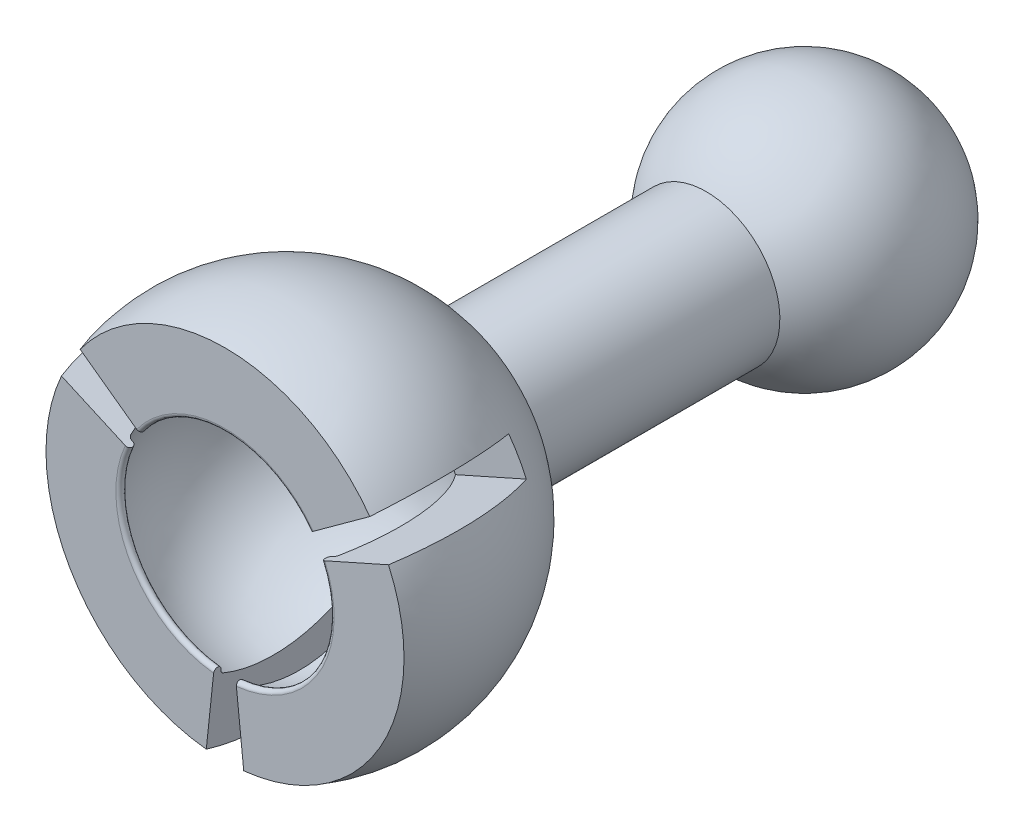
ISO-10303-21;
HEADER;
FILE_DESCRIPTION(('STEP AP214'),'2;1');
FILE_NAME('part.step','',(''),(''),'','','');
FILE_SCHEMA(('AUTOMOTIVE_DESIGN { 1 0 10303 214 1 1 1 1 }'));
ENDSEC;
DATA;
#1=APPLICATION_CONTEXT('core data for automotive mechanical design processes');
#2=APPLICATION_PROTOCOL_DEFINITION('international standard','automotive_design',2000,#1);
#3=PRODUCT_CONTEXT('',#1,'mechanical');
#4=PRODUCT('Part','Part','',(#3));
#5=PRODUCT_RELATED_PRODUCT_CATEGORY('part','',(#4));
#6=PRODUCT_DEFINITION_FORMATION('','',#4);
#7=PRODUCT_DEFINITION_CONTEXT('part definition',#1,'design');
#8=PRODUCT_DEFINITION('design','',#6,#7);
#9=PRODUCT_DEFINITION_SHAPE('','',#8);
#10=(LENGTH_UNIT() NAMED_UNIT(*) SI_UNIT(.MILLI.,.METRE.));
#11=(NAMED_UNIT(*) PLANE_ANGLE_UNIT() SI_UNIT($,.RADIAN.));
#12=(NAMED_UNIT(*) SI_UNIT($,.STERADIAN.) SOLID_ANGLE_UNIT());
#13=UNCERTAINTY_MEASURE_WITH_UNIT(LENGTH_MEASURE(1.E-05),#10,'distance_accuracy_value','');
#14=(GEOMETRIC_REPRESENTATION_CONTEXT(3) GLOBAL_UNCERTAINTY_ASSIGNED_CONTEXT((#13)) GLOBAL_UNIT_ASSIGNED_CONTEXT((#10,
#11,#12)) REPRESENTATION_CONTEXT('',''));
#15=CARTESIAN_POINT('',(0.,0.,0.));
#16=DIRECTION('',(0.,0.,1.));
#17=DIRECTION('',(1.,0.,0.));
#18=AXIS2_PLACEMENT_3D('',#15,#16,#17);
#19=CARTESIAN_POINT('',(0.,-7.29109045342327,19.6));
#20=DIRECTION('',(0.,0.,1.));
#21=DIRECTION('',(0.,-1.,0.));
#22=AXIS2_PLACEMENT_3D('',#19,#20,#21);
#23=PLANE('',#22);
#24=CARTESIAN_POINT('',(0.,0.,19.6));
#25=DIRECTION('',(0.,0.,1.));
#26=DIRECTION('',(0.,-1.,0.));
#27=AXIS2_PLACEMENT_3D('',#24,#25,#26);
#28=CIRCLE('',#27,7.29109045342327);
#29=CARTESIAN_POINT('',(5.89861608434435,4.28559544165267,19.6));
#30=VERTEX_POINT('',#29);
#31=CARTESIAN_POINT('',(-5.89861608434441,4.28559544165258,19.6));
#32=VERTEX_POINT('',#31);
#33=EDGE_CURVE('E289',#30,#32,#28,.T.);
#34=ORIENTED_EDGE('',*,*,#33,.T.);
#35=DIRECTION('',(-0.809016994374953,0.587785252292466,0.));
#36=VECTOR('',#35,1.);
#37=CARTESIAN_POINT('',(-5.89861608434441,4.28559544165258,19.6));
#38=LINE('',#37,#36);
#39=CARTESIAN_POINT('',(-3.5962602665025,2.61283602538991,19.6));
#40=VERTEX_POINT('',#39);
#41=EDGE_CURVE('E174',#40,#32,#38,.T.);
#42=ORIENTED_EDGE('',*,*,#41,.F.);
#43=CARTESIAN_POINT('',(0.,0.,19.6));
#44=DIRECTION('',(0.,0.,1.));
#45=DIRECTION('',(0.,-1.,0.));
#46=AXIS2_PLACEMENT_3D('',#43,#44,#45);
#47=CIRCLE('',#46,4.44522215417857);
#48=CARTESIAN_POINT('',(3.59626026650247,2.61283602538996,19.6));
#49=VERTEX_POINT('',#48);
#50=EDGE_CURVE('E285',#49,#40,#47,.T.);
#51=ORIENTED_EDGE('',*,*,#50,.F.);
#52=DIRECTION('',(0.809016994374945,0.587785252292477,0.));
#53=VECTOR('',#52,1.);
#54=CARTESIAN_POINT('',(5.89861608434435,4.28559544165267,19.6));
#55=LINE('',#54,#53);
#56=EDGE_CURVE('E223',#49,#30,#55,.T.);
#57=ORIENTED_EDGE('',*,*,#56,.T.);
#58=EDGE_LOOP('',(#34,#42,#51,#57));
#59=FACE_BOUND('',#58,.T.);
#60=ADVANCED_FACE('F43',(#59),#23,.T.);
#61=CARTESIAN_POINT('',(0.,0.,19.45));
#62=DIRECTION('',(0.,0.,1.));
#63=DIRECTION('',(0.,-1.,0.));
#64=AXIS2_PLACEMENT_3D('',#61,#62,#63);
#65=TOROIDAL_SURFACE('',#64,4.44522215417857,0.15);
#66=ORIENTED_EDGE('',*,*,#50,.T.);
#67=CARTESIAN_POINT('',(-3.5962602665025,2.61283602538991,19.45));
#68=DIRECTION('',(-0.587785252292466,-0.809016994374953,0.));
#69=DIRECTION('',(0.,0.,-1.));
#70=AXIS2_PLACEMENT_3D('',#67,#68,#69);
#71=CIRCLE('',#70,0.15);
#72=CARTESIAN_POINT('',(-3.6058111047905,2.61977511558424,19.3004652865878));
#73=VERTEX_POINT('',#72);
#74=EDGE_CURVE('E383',#73,#40,#71,.T.);
#75=ORIENTED_EDGE('',*,*,#74,.F.);
#76=CARTESIAN_POINT('',(0.,0.,19.3004652865878));
#77=DIRECTION('',(0.,0.,1.));
#78=DIRECTION('',(0.,-1.,0.));
#79=AXIS2_PLACEMENT_3D('',#76,#77,#78);
#80=CIRCLE('',#79,4.45702763954465);
#81=CARTESIAN_POINT('',(3.60581110479047,2.61977511558429,19.3004652865878));
#82=VERTEX_POINT('',#81);
#83=EDGE_CURVE('E280',#82,#73,#80,.T.);
#84=ORIENTED_EDGE('',*,*,#83,.F.);
#85=CARTESIAN_POINT('',(3.59626026650247,2.61283602538996,19.45));
#86=DIRECTION('',(-0.587785252292477,0.809016994374945,0.));
#87=DIRECTION('',(0.,0.,-1.));
#88=AXIS2_PLACEMENT_3D('',#85,#86,#87);
#89=CIRCLE('',#88,0.15);
#90=EDGE_CURVE('E220',#82,#49,#89,.T.);
#91=ORIENTED_EDGE('',*,*,#90,.T.);
#92=EDGE_LOOP('',(#66,#75,#84,#91));
#93=FACE_BOUND('',#92,.T.);
#94=ADVANCED_FACE('F307',(#93),#65,.T.);
#95=CARTESIAN_POINT('',(0.,0.,19.1010856687048));
#96=DIRECTION('',(0.,0.,1.));
#97=DIRECTION('',(0.,-1.,0.));
#98=AXIS2_PLACEMENT_3D('',#95,#96,#97);
#99=TOROIDAL_SURFACE('',#98,4.47276828669942,0.199999999999998);
#100=ORIENTED_EDGE('',*,*,#83,.T.);
#101=CARTESIAN_POINT('',(-3.61854555584117,2.62902723584336,19.1010856687048));
#102=DIRECTION('',(0.587785252292466,0.809016994374953,0.));
#103=DIRECTION('',(0.,0.,-1.));
#104=AXIS2_PLACEMENT_3D('',#101,#102,#103);
#105=CIRCLE('',#104,0.199999999999998);
#106=CARTESIAN_POINT('',(-3.76624129281428,2.73633446995941,19.1827626347744));
#107=VERTEX_POINT('',#106);
#108=EDGE_CURVE('E381',#107,#73,#105,.T.);
#109=ORIENTED_EDGE('',*,*,#108,.F.);
#110=CARTESIAN_POINT('',(0.,0.,19.1827626347744));
#111=DIRECTION('',(0.,0.,1.));
#112=DIRECTION('',(0.,-1.,0.));
#113=AXIS2_PLACEMENT_3D('',#110,#111,#112);
#114=CIRCLE('',#113,4.65533025758511);
#115=CARTESIAN_POINT('',(3.76624129281424,2.73633446995946,19.1827626347744));
#116=VERTEX_POINT('',#115);
#117=EDGE_CURVE('E275',#116,#107,#114,.T.);
#118=ORIENTED_EDGE('',*,*,#117,.F.);
#119=CARTESIAN_POINT('',(3.61854555584113,2.62902723584341,19.1010856687048));
#120=DIRECTION('',(0.587785252292477,-0.809016994374945,0.));
#121=DIRECTION('',(0.,0.,-1.));
#122=AXIS2_PLACEMENT_3D('',#119,#120,#121);
#123=CIRCLE('',#122,0.199999999999998);
#124=EDGE_CURVE('E217',#116,#82,#123,.T.);
#125=ORIENTED_EDGE('',*,*,#124,.T.);
#126=EDGE_LOOP('',(#100,#109,#118,#125));
#127=FACE_BOUND('',#126,.T.);
#128=ADVANCED_FACE('F315',(#127),#99,.F.);
#129=CARTESIAN_POINT('',(0.762126480641795,-7.25114909704004,19.6));
#130=VERTEX_POINT('',#129);
#131=CARTESIAN_POINT('',(6.66074256498615,2.96555365538742,19.6));
#132=VERTEX_POINT('',#131);
#133=EDGE_CURVE('E286',#130,#132,#28,.T.);
#134=ORIENTED_EDGE('',*,*,#133,.T.);
#135=DIRECTION('',(0.913545457642599,0.406736643075804,0.));
#136=VECTOR('',#135,1.);
#137=CARTESIAN_POINT('',(6.66074256498615,2.96555365538742,19.6));
#138=LINE('',#137,#136);
#139=CARTESIAN_POINT('',(4.06091250716208,1.80803473671678,19.6));
#140=VERTEX_POINT('',#139);
#141=EDGE_CURVE('E207',#140,#132,#138,.T.);
#142=ORIENTED_EDGE('',*,*,#141,.F.);
#143=CARTESIAN_POINT('',(0.464652240659615,-4.42087076210671,19.6));
#144=VERTEX_POINT('',#143);
#145=EDGE_CURVE('E281',#144,#140,#47,.T.);
#146=ORIENTED_EDGE('',*,*,#145,.F.);
#147=DIRECTION('',(0.104528463267654,-0.994521895368273,0.));
#148=VECTOR('',#147,1.);
#149=CARTESIAN_POINT('',(0.762126480641795,-7.25114909704004,19.6));
#150=LINE('',#149,#148);
#151=EDGE_CURVE('E262',#144,#130,#150,.T.);
#152=ORIENTED_EDGE('',*,*,#151,.T.);
#153=EDGE_LOOP('',(#134,#142,#146,#152));
#154=FACE_BOUND('',#153,.T.);
#155=ADVANCED_FACE('F310',(#154),#23,.T.);
#156=ORIENTED_EDGE('',*,*,#145,.T.);
#157=CARTESIAN_POINT('',(4.06091250716208,1.80803473671679,19.45));
#158=DIRECTION('',(-0.406736643075804,0.913545457642599,0.));
#159=DIRECTION('',(0.,0.,-1.));
#160=AXIS2_PLACEMENT_3D('',#157,#158,#159);
#161=CIRCLE('',#160,0.15);
#162=CARTESIAN_POINT('',(4.07169735469353,1.81283646020446,19.3004652865878));
#163=VERTEX_POINT('',#162);
#164=EDGE_CURVE('E205',#163,#140,#161,.T.);
#165=ORIENTED_EDGE('',*,*,#164,.F.);
#166=CARTESIAN_POINT('',(0.46588624990306,-4.43261157578873,19.3004652865878));
#167=VERTEX_POINT('',#166);
#168=EDGE_CURVE('E276',#167,#163,#80,.T.);
#169=ORIENTED_EDGE('',*,*,#168,.F.);
#170=CARTESIAN_POINT('',(0.464652240659615,-4.42087076210671,19.45));
#171=DIRECTION('',(0.994521895368273,0.104528463267654,0.));
#172=DIRECTION('',(0.,0.,-1.));
#173=AXIS2_PLACEMENT_3D('',#170,#171,#172);
#174=CIRCLE('',#173,0.15);
#175=EDGE_CURVE('E259',#167,#144,#174,.T.);
#176=ORIENTED_EDGE('',*,*,#175,.T.);
#177=EDGE_LOOP('',(#156,#165,#169,#176));
#178=FACE_BOUND('',#177,.T.);
#179=ADVANCED_FACE('F318',(#178),#65,.T.);
#180=ORIENTED_EDGE('',*,*,#168,.T.);
#181=CARTESIAN_POINT('',(4.08607715140213,1.81923875818804,19.1010856687048));
#182=DIRECTION('',(0.406736643075804,-0.913545457642599,0.));
#183=DIRECTION('',(0.,0.,-1.));
#184=AXIS2_PLACEMENT_3D('',#181,#182,#183);
#185=CIRCLE('',#184,0.199999999999998);
#186=CARTESIAN_POINT('',(4.25285581064303,1.89349340137938,19.1827626347744));
#187=VERTEX_POINT('',#186);
#188=EDGE_CURVE('E203',#187,#163,#185,.T.);
#189=ORIENTED_EDGE('',*,*,#188,.F.);
#190=CARTESIAN_POINT('',(0.486614517828782,-4.62982787133882,19.1827626347744));
#191=VERTEX_POINT('',#190);
#192=EDGE_CURVE('E271',#191,#187,#114,.T.);
#193=ORIENTED_EDGE('',*,*,#192,.F.);
#194=CARTESIAN_POINT('',(0.467531595560987,-4.44826599403141,19.1010856687048));
#195=DIRECTION('',(-0.994521895368273,-0.104528463267654,0.));
#196=DIRECTION('',(0.,0.,-1.));
#197=AXIS2_PLACEMENT_3D('',#194,#195,#196);
#198=CIRCLE('',#197,0.199999999999998);
#199=EDGE_CURVE('E256',#191,#167,#198,.T.);
#200=ORIENTED_EDGE('',*,*,#199,.T.);
#201=EDGE_LOOP('',(#180,#189,#193,#200));
#202=FACE_BOUND('',#201,.T.);
#203=ADVANCED_FACE('F354',(#202),#99,.F.);
#204=CARTESIAN_POINT('',(0.,0.,17.1));
#205=DIRECTION('',(0.,0.,1.));
#206=DIRECTION('',(0.,-1.,0.));
#207=AXIS2_PLACEMENT_3D('',#204,#205,#206);
#208=SPHERICAL_SURFACE('',#207,5.1);
#209=CARTESIAN_POINT('',(0.,0.,12.0554484837599));
#210=DIRECTION('',(0.,0.,1.));
#211=DIRECTION('',(1.,0.,0.));
#212=AXIS2_PLACEMENT_3D('',#209,#210,#211);
#213=CIRCLE('',#212,0.75);
#214=CARTESIAN_POINT('',(0.75,0.,12.0554484837599));
#215=VERTEX_POINT('',#214);
#216=EDGE_CURVE('E179',#215,#215,#213,.T.);
#217=ORIENTED_EDGE('',*,*,#216,.F.);
#218=EDGE_LOOP('',(#217));
#219=FACE_BOUND('',#218,.T.);
#220=CARTESIAN_POINT('',(0.,0.,17.1));
#221=DIRECTION('',(0.406736643075791,0.913545457642605,0.));
#222=DIRECTION('',(0.,0.,-1.));
#223=AXIS2_PLACEMENT_3D('',#220,#221,#222);
#224=CIRCLE('',#223,5.1);
#225=CARTESIAN_POINT('',(-3.38874882098821,1.50876818240939,13.6));
#226=VERTEX_POINT('',#225);
#227=CARTESIAN_POINT('',(-4.25285581064305,1.89349340137932,19.1827626347744));
#228=VERTEX_POINT('',#227);
#229=EDGE_CURVE('E373',#226,#228,#224,.T.);
#230=ORIENTED_EDGE('',*,*,#229,.T.);
#231=CARTESIAN_POINT('',(-0.486614517828782,-4.62982787133882,19.1827626347744));
#232=VERTEX_POINT('',#231);
#233=EDGE_CURVE('E270',#228,#232,#114,.T.);
#234=ORIENTED_EDGE('',*,*,#233,.T.);
#235=CARTESIAN_POINT('',(0.,0.,17.1));
#236=DIRECTION('',(-0.994521895368273,0.104528463267654,0.));
#237=DIRECTION('',(0.,0.,-1.));
#238=AXIS2_PLACEMENT_3D('',#235,#236,#237);
#239=CIRCLE('',#238,5.1);
#240=CARTESIAN_POINT('',(-0.387742836105862,-3.68912665722506,13.6));
#241=VERTEX_POINT('',#240);
#242=EDGE_CURVE('E236',#241,#232,#239,.T.);
#243=ORIENTED_EDGE('',*,*,#242,.F.);
#244=CARTESIAN_POINT('',(0.,0.,13.6));
#245=DIRECTION('',(0.,0.,-1.));
#246=DIRECTION('',(-1.,0.,0.));
#247=AXIS2_PLACEMENT_3D('',#244,#245,#246);
#248=CIRCLE('',#247,3.70944739819827);
#249=CARTESIAN_POINT('',(0.387742836105862,-3.68912665722506,13.6));
#250=VERTEX_POINT('',#249);
#251=EDGE_CURVE('E265',#250,#241,#248,.T.);
#252=ORIENTED_EDGE('',*,*,#251,.F.);
#253=CARTESIAN_POINT('',(0.,0.,17.1));
#254=DIRECTION('',(-0.994521895368273,-0.104528463267654,0.));
#255=DIRECTION('',(0.,0.,-1.));
#256=AXIS2_PLACEMENT_3D('',#253,#254,#255);
#257=CIRCLE('',#256,5.1);
#258=EDGE_CURVE('E253',#250,#191,#257,.T.);
#259=ORIENTED_EDGE('',*,*,#258,.T.);
#260=ORIENTED_EDGE('',*,*,#192,.T.);
#261=CARTESIAN_POINT('',(0.,0.,17.1));
#262=DIRECTION('',(0.406736643075804,-0.913545457642599,0.));
#263=DIRECTION('',(0.,0.,-1.));
#264=AXIS2_PLACEMENT_3D('',#261,#262,#263);
#265=CIRCLE('',#264,5.1);
#266=CARTESIAN_POINT('',(3.38874882098819,1.50876818240944,13.6));
#267=VERTEX_POINT('',#266);
#268=EDGE_CURVE('E67',#267,#187,#265,.T.);
#269=ORIENTED_EDGE('',*,*,#268,.F.);
#270=CARTESIAN_POINT('',(0.,0.,13.6));
#271=DIRECTION('',(0.,0.,-1.));
#272=DIRECTION('',(0.500000000000004,-0.866025403784436,0.));
#273=AXIS2_PLACEMENT_3D('',#270,#271,#272);
#274=CIRCLE('',#273,3.70944739819827);
#275=CARTESIAN_POINT('',(3.00100598488232,2.18035847481564,13.6));
#276=VERTEX_POINT('',#275);
#277=EDGE_CURVE('E226',#276,#267,#274,.T.);
#278=ORIENTED_EDGE('',*,*,#277,.F.);
#279=CARTESIAN_POINT('',(0.,0.,17.1));
#280=DIRECTION('',(0.587785252292477,-0.809016994374945,0.));
#281=DIRECTION('',(0.,0.,-1.));
#282=AXIS2_PLACEMENT_3D('',#279,#280,#281);
#283=CIRCLE('',#282,5.1);
#284=EDGE_CURVE('E214',#276,#116,#283,.T.);
#285=ORIENTED_EDGE('',*,*,#284,.T.);
#286=ORIENTED_EDGE('',*,*,#117,.T.);
#287=CARTESIAN_POINT('',(0.,0.,17.1));
#288=DIRECTION('',(0.587785252292466,0.809016994374953,0.));
#289=DIRECTION('',(0.,0.,-1.));
#290=AXIS2_PLACEMENT_3D('',#287,#288,#289);
#291=CIRCLE('',#290,5.1);
#292=CARTESIAN_POINT('',(-3.00100598488235,2.1803584748156,13.6));
#293=VERTEX_POINT('',#292);
#294=EDGE_CURVE('E59',#293,#107,#291,.T.);
#295=ORIENTED_EDGE('',*,*,#294,.F.);
#296=CARTESIAN_POINT('',(0.,0.,13.6));
#297=DIRECTION('',(0.,0.,-1.));
#298=DIRECTION('',(0.499999999999992,0.866025403784443,0.));
#299=AXIS2_PLACEMENT_3D('',#296,#297,#298);
#300=CIRCLE('',#299,3.70944739819827);
#301=EDGE_CURVE('E186',#226,#293,#300,.T.);
#302=ORIENTED_EDGE('',*,*,#301,.F.);
#303=EDGE_LOOP('',(#230,#234,#243,#252,#259,#260,#269,#278,#285,#286,#295,#302));
#304=FACE_BOUND('',#303,.T.);
#305=ADVANCED_FACE('F45',(#219,#304),#208,.F.);
#306=CARTESIAN_POINT('',(0.,0.,-4.));
#307=DIRECTION('',(0.,0.,1.));
#308=DIRECTION('',(0.,-1.,0.));
#309=AXIS2_PLACEMENT_3D('',#306,#307,#308);
#310=SPHERICAL_SURFACE('',#309,5.);
#311=CARTESIAN_POINT('',(0.,0.,-8.9434299833213));
#312=DIRECTION('',(0.,0.,1.));
#313=DIRECTION('',(1.,0.,0.));
#314=AXIS2_PLACEMENT_3D('',#311,#312,#313);
#315=CIRCLE('',#314,0.75);
#316=CARTESIAN_POINT('',(0.,-0.749999999999988,-8.9434299833213));
#317=VERTEX_POINT('',#316);
#318=EDGE_CURVE('E47',#317,#317,#315,.F.);
#319=CARTESIAN_POINT('',(0.,0.,0.));
#320=DIRECTION('',(0.,0.,1.));
#321=DIRECTION('',(0.,-1.,0.));
#322=AXIS2_PLACEMENT_3D('',#319,#320,#321);
#323=CIRCLE('',#322,3.);
#324=CARTESIAN_POINT('',(0.,-3.,0.));
#325=VERTEX_POINT('',#324);
#326=EDGE_CURVE('E11',#325,#325,#323,.T.);
#327=CARTESIAN_POINT('',(0.,-0.749999999999988,-8.9434299833213));
#328=CARTESIAN_POINT('',(0.,-0.870885414938892,-8.92509841181209));
#329=CARTESIAN_POINT('',(0.,-0.991094481339852,-8.90231620034963));
#330=CARTESIAN_POINT('',(0.,-1.22952172383884,-8.84801013620433));
#331=CARTESIAN_POINT('',(0.,-1.34773989993687,-8.81648628352149));
#332=CARTESIAN_POINT('',(0.,-1.58154716860296,-8.74485657562153));
#333=CARTESIAN_POINT('',(0.,-1.69713626117102,-8.70475072040442));
#334=CARTESIAN_POINT('',(0.,-1.92506418177985,-8.61617541121397));
#335=CARTESIAN_POINT('',(0.,-2.03740300982062,-8.56770595724064));
#336=CARTESIAN_POINT('',(0.,-2.25822593558462,-8.46266346839177));
#337=CARTESIAN_POINT('',(0.,-2.36671003330785,-8.40609043351624));
#338=CARTESIAN_POINT('',(0.,-2.57923997439409,-8.28514529687983));
#339=CARTESIAN_POINT('',(0.,-2.68328581775711,-8.22077319511896));
#340=CARTESIAN_POINT('',(0.,-2.88637954553864,-8.08457614978542));
#341=CARTESIAN_POINT('',(0.,-2.98542742995715,-8.01275120621274));
#342=CARTESIAN_POINT('',(0.,-3.17799243553554,-7.86203485828768));
#343=CARTESIAN_POINT('',(0.,-3.27150955669543,-7.7831434539353));
#344=CARTESIAN_POINT('',(0.,-3.45250997906654,-7.61871856063181));
#345=CARTESIAN_POINT('',(0.,-3.53999328027776,-7.53318507168069));
#346=CARTESIAN_POINT('',(0.,-3.70845546479972,-7.35593611973297));
#347=CARTESIAN_POINT('',(0.,-3.78943434811046,-7.26422065673636));
#348=CARTESIAN_POINT('',(0.,-3.94445208775483,-7.07510112064164));
#349=CARTESIAN_POINT('',(0.,-4.01849094408845,-6.97769704754354));
#350=CARTESIAN_POINT('',(0.,-4.15923035320616,-6.77772425621644));
#351=CARTESIAN_POINT('',(0.,-4.22593090599023,-6.67515553798745));
#352=CARTESIAN_POINT('',(0.,-4.35163490628967,-6.465405203411));
#353=CARTESIAN_POINT('',(0.,-4.41063835380503,-6.35822358706355));
#354=CARTESIAN_POINT('',(0.,-4.5206307468261,-6.13982401741015));
#355=CARTESIAN_POINT('',(0.,-4.5716196923318,-6.0286060641042));
#356=CARTESIAN_POINT('',(0.,-4.66530879693345,-5.80273209432034));
#357=CARTESIAN_POINT('',(0.,-4.7080089560294,-5.68807607784242));
#358=CARTESIAN_POINT('',(0.,-4.78489079120991,-5.45594274984674));
#359=CARTESIAN_POINT('',(0.,-4.81907246729446,-5.33846543832899));
#360=CARTESIAN_POINT('',(0.,-4.87873346325345,-5.10132146495369));
#361=CARTESIAN_POINT('',(0.,-4.90421278312788,-4.98165480309616));
#362=CARTESIAN_POINT('',(0.,-4.94633200597854,-4.740775850895));
#363=CARTESIAN_POINT('',(0.,-4.96297190895477,-4.61956356055138));
#364=CARTESIAN_POINT('',(0.,-4.98732278712059,-4.37624538761821));
#365=CARTESIAN_POINT('',(0.,-4.99503376231018,-4.25413950502866));
#366=CARTESIAN_POINT('',(0.,-5.00148530532055,-4.00969099073562));
#367=CARTESIAN_POINT('',(0.,-5.00022587314133,-3.88734835903213));
#368=CARTESIAN_POINT('',(0.,-4.98874337626345,-3.64308446319064));
#369=CARTESIAN_POINT('',(0.,-4.97852031156478,-3.52116319905265));
#370=CARTESIAN_POINT('',(0.,-4.94916554250554,-3.27839788834407));
#371=CARTESIAN_POINT('',(0.,-4.93003383814496,-3.15755384177349));
#372=CARTESIAN_POINT('',(0.,-4.88296470472834,-2.91759302160374));
#373=CARTESIAN_POINT('',(0.,-4.85502727567231,-2.79847624800457));
#374=CARTESIAN_POINT('',(0.,-4.79049697661662,-2.56261073741801));
#375=CARTESIAN_POINT('',(0.,-4.75390410661696,-2.44586200043062));
#376=CARTESIAN_POINT('',(0.,-4.67225976872355,-2.21536058931491));
#377=CARTESIAN_POINT('',(0.,-4.62720830082979,-2.1016079151866));
#378=CARTESIAN_POINT('',(0.,-4.52888911460351,-1.87771053573548));
#379=CARTESIAN_POINT('',(0.,-4.47562139627099,-1.76756583041268));
#380=CARTESIAN_POINT('',(0.,-4.36115624250127,-1.55147689965902));
#381=CARTESIAN_POINT('',(0.,-4.29995880706407,-1.44553267422817));
#382=CARTESIAN_POINT('',(0.,-4.16996345244509,-1.23841456852128));
#383=CARTESIAN_POINT('',(0.,-4.10116553326332,-1.13724068824525));
#384=CARTESIAN_POINT('',(0.,-3.95633916639424,-0.940207664449647));
#385=CARTESIAN_POINT('',(0.,-3.88031071870694,-0.844348520930074));
#386=CARTESIAN_POINT('',(0.,-3.72143275477357,-0.658460073285698));
#387=CARTESIAN_POINT('',(0.,-3.6385832385275,-0.568430769160897));
#388=CARTESIAN_POINT('',(0.,-3.46650701492828,-0.39468835290407));
#389=CARTESIAN_POINT('',(0.,-3.37728030757512,-0.310975240772046));
#390=CARTESIAN_POINT('',(0.,-3.1929363744398,-0.150307842446107));
#391=CARTESIAN_POINT('',(0.,-3.09781914865764,-0.0733535562521928));
#392=CARTESIAN_POINT('',(0.,-3.,0.));
#393=B_SPLINE_CURVE_WITH_KNOTS('',3,(#327,#328,#329,#330,#331,#332,#333,#334,#335,#336,#337,
#338,#339,#340,#341,#342,#343,#344,#345,#346,#347,#348,#349,#350,#351,#352,#353,#354,#355,#356,
#357,#358,#359,#360,#361,#362,#363,#364,#365,#366,#367,#368,#369,#370,#371,#372,#373,#374,#375,
#376,#377,#378,#379,#380,#381,#382,#383,#384,#385,#386,#387,#388,#389,#390,#391,#392),
.UNSPECIFIED.,.F.,.F.,(4,2,2,2,2,2,2,2,2,2,2,2,2,2,2,2,2,2,2,2,2,2,2,2,2,2,2,2,2,2,2,2,4),(0.,
0.36671826628604,0.733436532572079,1.10015479885812,1.46687306514416,1.8335913314302,
2.20030959771624,2.56702786400228,2.93374613028832,3.30046439657436,3.6671826628604,
4.03390092914644,4.40061919543247,4.76733746171852,5.13405572800456,5.50077399429059,
5.86749226057663,6.23421052686267,6.60092879314871,6.96764705943475,7.33436532572079,
7.70108359200683,8.06780185829287,8.43452012457891,8.80123839086495,9.16795665715099,
9.53467492343703,9.90139318972307,10.2681114560091,10.6348297222952,11.0015479885812,
11.3682662548672,11.7349845211533),.UNSPECIFIED.);
#394=EDGE_CURVE('BSEAM295',#317,#325,#393,.T.);
#395=ORIENTED_EDGE('',*,*,#318,.F.);
#396=ORIENTED_EDGE('',*,*,#326,.F.);
#397=ORIENTED_EDGE('',*,*,#394,.T.);
#398=ORIENTED_EDGE('',*,*,#394,.F.);
#399=EDGE_LOOP('',(#395,#397,#396,#398));
#400=FACE_BOUND('',#399,.T.);
#401=ADVANCED_FACE('F295',(#400),#310,.T.);
#402=CARTESIAN_POINT('',(0.,0.,0.));
#403=DIRECTION('',(0.,0.,1.));
#404=DIRECTION('',(0.,-1.,0.));
#405=AXIS2_PLACEMENT_3D('',#402,#403,#404);
#406=CYLINDRICAL_SURFACE('',#405,3.);
#407=ORIENTED_EDGE('',*,*,#326,.T.);
#408=EDGE_LOOP('',(#407));
#409=FACE_BOUND('',#408,.T.);
#410=CARTESIAN_POINT('',(0.,0.,10.));
#411=DIRECTION('',(0.,0.,1.));
#412=DIRECTION('',(0.,-1.,0.));
#413=AXIS2_PLACEMENT_3D('',#410,#411,#412);
#414=CIRCLE('',#413,3.);
#415=CARTESIAN_POINT('',(0.,-3.,10.));
#416=VERTEX_POINT('',#415);
#417=EDGE_CURVE('E52',#416,#416,#414,.T.);
#418=ORIENTED_EDGE('',*,*,#417,.F.);
#419=EDGE_LOOP('',(#418));
#420=FACE_BOUND('',#419,.T.);
#421=ADVANCED_FACE('F293',(#409,#420),#406,.T.);
#422=CARTESIAN_POINT('',(0.,0.,17.1));
#423=DIRECTION('',(0.,0.,1.));
#424=DIRECTION('',(0.,-1.,0.));
#425=AXIS2_PLACEMENT_3D('',#422,#423,#424);
#426=SPHERICAL_SURFACE('',#425,7.70778826901725);
#427=CARTESIAN_POINT('',(0.,0.,17.1));
#428=DIRECTION('',(-0.406736643075791,-0.913545457642605,0.));
#429=DIRECTION('',(0.,0.,-1.));
#430=AXIS2_PLACEMENT_3D('',#427,#428,#429);
#431=CIRCLE('',#430,7.70778826901725);
#432=CARTESIAN_POINT('',(-6.66074256498619,2.96555365538733,19.6));
#433=VERTEX_POINT('',#432);
#434=CARTESIAN_POINT('',(-6.27360340617274,2.79318819667737,13.6));
#435=VERTEX_POINT('',#434);
#436=EDGE_CURVE('E192',#433,#435,#431,.T.);
#437=ORIENTED_EDGE('',*,*,#436,.T.);
#438=CARTESIAN_POINT('',(0.,0.,13.6));
#439=DIRECTION('',(0.,0.,-1.));
#440=DIRECTION('',(0.499999999999992,0.866025403784443,0.));
#441=AXIS2_PLACEMENT_3D('',#438,#439,#440);
#442=CIRCLE('',#441,6.86731388535576);
#443=CARTESIAN_POINT('',(-5.55577363895989,4.03650582467538,13.6));
#444=VERTEX_POINT('',#443);
#445=EDGE_CURVE('E183',#435,#444,#442,.T.);
#446=ORIENTED_EDGE('',*,*,#445,.T.);
#447=CARTESIAN_POINT('',(0.,0.,17.1));
#448=DIRECTION('',(-0.587785252292466,-0.809016994374953,0.));
#449=DIRECTION('',(0.,0.,-1.));
#450=AXIS2_PLACEMENT_3D('',#447,#448,#449);
#451=CIRCLE('',#450,7.70778826901725);
#452=EDGE_CURVE('E169',#32,#444,#451,.T.);
#453=ORIENTED_EDGE('',*,*,#452,.F.);
#454=ORIENTED_EDGE('',*,*,#33,.F.);
#455=CARTESIAN_POINT('',(0.,0.,17.1));
#456=DIRECTION('',(-0.587785252292477,0.809016994374945,0.));
#457=DIRECTION('',(0.,0.,-1.));
#458=AXIS2_PLACEMENT_3D('',#455,#456,#457);
#459=CIRCLE('',#458,7.70778826901725);
#460=CARTESIAN_POINT('',(5.55577363895983,4.03650582467546,13.6));
#461=VERTEX_POINT('',#460);
#462=EDGE_CURVE('E209',#30,#461,#459,.T.);
#463=ORIENTED_EDGE('',*,*,#462,.T.);
#464=CARTESIAN_POINT('',(0.,0.,13.6));
#465=DIRECTION('',(0.,0.,-1.));
#466=DIRECTION('',(0.500000000000004,-0.866025403784436,0.));
#467=AXIS2_PLACEMENT_3D('',#464,#465,#466);
#468=CIRCLE('',#467,6.86731388535576);
#469=CARTESIAN_POINT('',(6.2736034061727,2.79318819667746,13.6));
#470=VERTEX_POINT('',#469);
#471=EDGE_CURVE('E228',#461,#470,#468,.T.);
#472=ORIENTED_EDGE('',*,*,#471,.T.);
#473=CARTESIAN_POINT('',(0.,0.,17.1));
#474=DIRECTION('',(-0.406736643075804,0.913545457642599,0.));
#475=DIRECTION('',(0.,0.,-1.));
#476=AXIS2_PLACEMENT_3D('',#473,#474,#475);
#477=CIRCLE('',#476,7.70778826901725);
#478=EDGE_CURVE('E193',#132,#470,#477,.T.);
#479=ORIENTED_EDGE('',*,*,#478,.F.);
#480=ORIENTED_EDGE('',*,*,#133,.F.);
#481=CARTESIAN_POINT('',(0.,0.,17.1));
#482=DIRECTION('',(0.994521895368273,0.104528463267654,0.));
#483=DIRECTION('',(0.,0.,-1.));
#484=AXIS2_PLACEMENT_3D('',#481,#482,#483);
#485=CIRCLE('',#484,7.70778826901725);
#486=CARTESIAN_POINT('',(0.717829767212857,-6.82969402135287,13.6));
#487=VERTEX_POINT('',#486);
#488=EDGE_CURVE('E248',#130,#487,#485,.T.);
#489=ORIENTED_EDGE('',*,*,#488,.T.);
#490=CARTESIAN_POINT('',(0.,0.,13.6));
#491=DIRECTION('',(0.,0.,-1.));
#492=DIRECTION('',(-1.,0.,0.));
#493=AXIS2_PLACEMENT_3D('',#490,#491,#492);
#494=CIRCLE('',#493,6.86731388535576);
#495=CARTESIAN_POINT('',(-0.717829767212857,-6.82969402135287,13.6));
#496=VERTEX_POINT('',#495);
#497=EDGE_CURVE('E267',#487,#496,#494,.T.);
#498=ORIENTED_EDGE('',*,*,#497,.T.);
#499=CARTESIAN_POINT('',(0.,0.,17.1));
#500=DIRECTION('',(0.994521895368273,-0.104528463267654,0.));
#501=DIRECTION('',(0.,0.,-1.));
#502=AXIS2_PLACEMENT_3D('',#499,#500,#501);
#503=CIRCLE('',#502,7.70778826901725);
#504=CARTESIAN_POINT('',(-0.762126480641795,-7.25114909704004,19.6));
#505=VERTEX_POINT('',#504);
#506=EDGE_CURVE('E231',#505,#496,#503,.T.);
#507=ORIENTED_EDGE('',*,*,#506,.F.);
#508=EDGE_CURVE('E284',#433,#505,#28,.T.);
#509=ORIENTED_EDGE('',*,*,#508,.F.);
#510=EDGE_LOOP('',(#437,#446,#453,#454,#463,#472,#479,#480,#489,#498,#507,#509));
#511=FACE_BOUND('',#510,.T.);
#512=ORIENTED_EDGE('',*,*,#417,.T.);
#513=EDGE_LOOP('',(#512));
#514=FACE_BOUND('',#513,.T.);
#515=ADVANCED_FACE('F189',(#511,#514),#426,.T.);
#516=DIRECTION('',(-0.913545457642605,0.406736643075791,0.));
#517=VECTOR('',#516,1.);
#518=CARTESIAN_POINT('',(-6.66074256498619,2.96555365538733,19.6));
#519=LINE('',#518,#517);
#520=CARTESIAN_POINT('',(-4.06091250716211,1.80803473671673,19.6));
#521=VERTEX_POINT('',#520);
#522=EDGE_CURVE('E197',#521,#433,#519,.T.);
#523=ORIENTED_EDGE('',*,*,#522,.T.);
#524=ORIENTED_EDGE('',*,*,#508,.T.);
#525=DIRECTION('',(-0.104528463267654,-0.994521895368273,0.));
#526=VECTOR('',#525,1.);
#527=CARTESIAN_POINT('',(-0.762126480641795,-7.25114909704004,19.6));
#528=LINE('',#527,#526);
#529=CARTESIAN_POINT('',(-0.464652240659615,-4.42087076210671,19.6));
#530=VERTEX_POINT('',#529);
#531=EDGE_CURVE('E245',#530,#505,#528,.T.);
#532=ORIENTED_EDGE('',*,*,#531,.F.);
#533=EDGE_CURVE('E279',#521,#530,#47,.T.);
#534=ORIENTED_EDGE('',*,*,#533,.F.);
#535=EDGE_LOOP('',(#523,#524,#532,#534));
#536=FACE_BOUND('',#535,.T.);
#537=ADVANCED_FACE('F302',(#536),#23,.T.);
#538=CARTESIAN_POINT('',(-4.06091250716211,1.80803473671673,19.45));
#539=DIRECTION('',(-0.406736643075791,-0.913545457642605,0.));
#540=DIRECTION('',(0.,0.,-1.));
#541=AXIS2_PLACEMENT_3D('',#538,#539,#540);
#542=CIRCLE('',#541,0.15);
#543=CARTESIAN_POINT('',(-4.07169735469355,1.81283646020441,19.3004652865878));
#544=VERTEX_POINT('',#543);
#545=EDGE_CURVE('E334',#544,#521,#542,.T.);
#546=ORIENTED_EDGE('',*,*,#545,.T.);
#547=ORIENTED_EDGE('',*,*,#533,.T.);
#548=CARTESIAN_POINT('',(-0.464652240659615,-4.42087076210671,19.45));
#549=DIRECTION('',(0.994521895368273,-0.104528463267654,0.));
#550=DIRECTION('',(0.,0.,-1.));
#551=AXIS2_PLACEMENT_3D('',#548,#549,#550);
#552=CIRCLE('',#551,0.15);
#553=CARTESIAN_POINT('',(-0.46588624990306,-4.43261157578873,19.3004652865878));
#554=VERTEX_POINT('',#553);
#555=EDGE_CURVE('E242',#554,#530,#552,.T.);
#556=ORIENTED_EDGE('',*,*,#555,.F.);
#557=EDGE_CURVE('E274',#544,#554,#80,.T.);
#558=ORIENTED_EDGE('',*,*,#557,.F.);
#559=EDGE_LOOP('',(#546,#547,#556,#558));
#560=FACE_BOUND('',#559,.T.);
#561=ADVANCED_FACE('F319',(#560),#65,.T.);
#562=CARTESIAN_POINT('',(-4.08607715140215,1.81923875818798,19.1010856687048));
#563=DIRECTION('',(0.406736643075791,0.913545457642605,0.));
#564=DIRECTION('',(0.,0.,-1.));
#565=AXIS2_PLACEMENT_3D('',#562,#563,#564);
#566=CIRCLE('',#565,0.199999999999998);
#567=EDGE_CURVE('E393',#228,#544,#566,.T.);
#568=ORIENTED_EDGE('',*,*,#567,.T.);
#569=ORIENTED_EDGE('',*,*,#557,.T.);
#570=CARTESIAN_POINT('',(-0.467531595560987,-4.44826599403141,19.1010856687048));
#571=DIRECTION('',(-0.994521895368273,0.104528463267654,0.));
#572=DIRECTION('',(0.,0.,-1.));
#573=AXIS2_PLACEMENT_3D('',#570,#571,#572);
#574=CIRCLE('',#573,0.199999999999998);
#575=EDGE_CURVE('E239',#232,#554,#574,.T.);
#576=ORIENTED_EDGE('',*,*,#575,.F.);
#577=ORIENTED_EDGE('',*,*,#233,.F.);
#578=EDGE_LOOP('',(#568,#569,#576,#577));
#579=FACE_BOUND('',#578,.T.);
#580=ADVANCED_FACE('F327',(#579),#99,.F.);
#581=CARTESIAN_POINT('',(0.717829767212857,-6.82969402135287,13.6));
#582=DIRECTION('',(0.,0.,1.));
#583=DIRECTION('',(1.,0.,0.));
#584=AXIS2_PLACEMENT_3D('',#581,#582,#583);
#585=PLANE('',#584);
#586=ORIENTED_EDGE('',*,*,#251,.T.);
#587=DIRECTION('',(0.104528463267654,0.994521895368273,0.));
#588=VECTOR('',#587,1.);
#589=CARTESIAN_POINT('',(-0.717829767212857,-6.82969402135287,13.6));
#590=LINE('',#589,#588);
#591=EDGE_CURVE('E233',#496,#241,#590,.T.);
#592=ORIENTED_EDGE('',*,*,#591,.F.);
#593=ORIENTED_EDGE('',*,*,#497,.F.);
#594=DIRECTION('',(-0.104528463267654,0.994521895368273,0.));
#595=VECTOR('',#594,1.);
#596=CARTESIAN_POINT('',(0.717829767212857,-6.82969402135287,13.6));
#597=LINE('',#596,#595);
#598=EDGE_CURVE('E251',#487,#250,#597,.T.);
#599=ORIENTED_EDGE('',*,*,#598,.T.);
#600=EDGE_LOOP('',(#586,#592,#593,#599));
#601=FACE_BOUND('',#600,.T.);
#602=ADVANCED_FACE('F365',(#601),#585,.T.);
#603=CARTESIAN_POINT('',(0.,0.,17.1));
#604=DIRECTION('',(0.994521895368273,0.104528463267654,0.));
#605=DIRECTION('',(0.,0.,-1.));
#606=AXIS2_PLACEMENT_3D('',#603,#604,#605);
#607=PLANE('',#606);
#608=ORIENTED_EDGE('',*,*,#488,.F.);
#609=ORIENTED_EDGE('',*,*,#151,.F.);
#610=ORIENTED_EDGE('',*,*,#175,.F.);
#611=ORIENTED_EDGE('',*,*,#199,.F.);
#612=ORIENTED_EDGE('',*,*,#258,.F.);
#613=ORIENTED_EDGE('',*,*,#598,.F.);
#614=EDGE_LOOP('',(#608,#609,#610,#611,#612,#613));
#615=FACE_BOUND('',#614,.T.);
#616=ADVANCED_FACE('F363',(#615),#607,.F.);
#617=CARTESIAN_POINT('',(0.,0.,17.1));
#618=DIRECTION('',(0.994521895368273,-0.104528463267654,0.));
#619=DIRECTION('',(0.,0.,-1.));
#620=AXIS2_PLACEMENT_3D('',#617,#618,#619);
#621=PLANE('',#620);
#622=ORIENTED_EDGE('',*,*,#506,.T.);
#623=ORIENTED_EDGE('',*,*,#591,.T.);
#624=ORIENTED_EDGE('',*,*,#242,.T.);
#625=ORIENTED_EDGE('',*,*,#575,.T.);
#626=ORIENTED_EDGE('',*,*,#555,.T.);
#627=ORIENTED_EDGE('',*,*,#531,.T.);
#628=EDGE_LOOP('',(#622,#623,#624,#625,#626,#627));
#629=FACE_BOUND('',#628,.T.);
#630=ADVANCED_FACE('F369',(#629),#621,.T.);
#631=CARTESIAN_POINT('',(5.55577363895983,4.03650582467546,13.6));
#632=DIRECTION('',(0.,0.,1.));
#633=DIRECTION('',(-0.500000000000004,0.866025403784436,0.));
#634=AXIS2_PLACEMENT_3D('',#631,#632,#633);
#635=PLANE('',#634);
#636=ORIENTED_EDGE('',*,*,#277,.T.);
#637=DIRECTION('',(-0.913545457642599,-0.406736643075804,0.));
#638=VECTOR('',#637,1.);
#639=CARTESIAN_POINT('',(6.2736034061727,2.79318819667746,13.6));
#640=LINE('',#639,#638);
#641=EDGE_CURVE('E195',#470,#267,#640,.T.);
#642=ORIENTED_EDGE('',*,*,#641,.F.);
#643=ORIENTED_EDGE('',*,*,#471,.F.);
#644=DIRECTION('',(-0.809016994374945,-0.587785252292477,0.));
#645=VECTOR('',#644,1.);
#646=CARTESIAN_POINT('',(5.55577363895983,4.03650582467546,13.6));
#647=LINE('',#646,#645);
#648=EDGE_CURVE('E212',#461,#276,#647,.T.);
#649=ORIENTED_EDGE('',*,*,#648,.T.);
#650=EDGE_LOOP('',(#636,#642,#643,#649));
#651=FACE_BOUND('',#650,.T.);
#652=ADVANCED_FACE('F345',(#651),#635,.T.);
#653=CARTESIAN_POINT('',(0.,0.,17.1));
#654=DIRECTION('',(-0.587785252292477,0.809016994374945,0.));
#655=DIRECTION('',(0.,0.,-1.));
#656=AXIS2_PLACEMENT_3D('',#653,#654,#655);
#657=PLANE('',#656);
#658=ORIENTED_EDGE('',*,*,#462,.F.);
#659=ORIENTED_EDGE('',*,*,#56,.F.);
#660=ORIENTED_EDGE('',*,*,#90,.F.);
#661=ORIENTED_EDGE('',*,*,#124,.F.);
#662=ORIENTED_EDGE('',*,*,#284,.F.);
#663=ORIENTED_EDGE('',*,*,#648,.F.);
#664=EDGE_LOOP('',(#658,#659,#660,#661,#662,#663));
#665=FACE_BOUND('',#664,.T.);
#666=ADVANCED_FACE('F341',(#665),#657,.F.);
#667=CARTESIAN_POINT('',(0.,0.,17.1));
#668=DIRECTION('',(-0.406736643075804,0.913545457642599,0.));
#669=DIRECTION('',(0.,0.,-1.));
#670=AXIS2_PLACEMENT_3D('',#667,#668,#669);
#671=PLANE('',#670);
#672=ORIENTED_EDGE('',*,*,#478,.T.);
#673=ORIENTED_EDGE('',*,*,#641,.T.);
#674=ORIENTED_EDGE('',*,*,#268,.T.);
#675=ORIENTED_EDGE('',*,*,#188,.T.);
#676=ORIENTED_EDGE('',*,*,#164,.T.);
#677=ORIENTED_EDGE('',*,*,#141,.T.);
#678=EDGE_LOOP('',(#672,#673,#674,#675,#676,#677));
#679=FACE_BOUND('',#678,.T.);
#680=ADVANCED_FACE('F347',(#679),#671,.T.);
#681=CARTESIAN_POINT('',(-6.27360340617274,2.79318819667737,13.6));
#682=DIRECTION('',(0.,0.,1.));
#683=DIRECTION('',(-0.499999999999992,-0.866025403784443,0.));
#684=AXIS2_PLACEMENT_3D('',#681,#682,#683);
#685=PLANE('',#684);
#686=ORIENTED_EDGE('',*,*,#301,.T.);
#687=DIRECTION('',(0.809016994374953,-0.587785252292466,0.));
#688=VECTOR('',#687,1.);
#689=CARTESIAN_POINT('',(-5.55577363895989,4.03650582467538,13.6));
#690=LINE('',#689,#688);
#691=EDGE_CURVE('E172',#444,#293,#690,.T.);
#692=ORIENTED_EDGE('',*,*,#691,.F.);
#693=ORIENTED_EDGE('',*,*,#445,.F.);
#694=DIRECTION('',(0.913545457642605,-0.406736643075791,0.));
#695=VECTOR('',#694,1.);
#696=CARTESIAN_POINT('',(-6.27360340617274,2.79318819667737,13.6));
#697=LINE('',#696,#695);
#698=EDGE_CURVE('E390',#435,#226,#697,.T.);
#699=ORIENTED_EDGE('',*,*,#698,.T.);
#700=EDGE_LOOP('',(#686,#692,#693,#699));
#701=FACE_BOUND('',#700,.T.);
#702=ADVANCED_FACE('F182',(#701),#685,.T.);
#703=CARTESIAN_POINT('',(0.,0.,17.1));
#704=DIRECTION('',(-0.406736643075791,-0.913545457642605,0.));
#705=DIRECTION('',(0.,0.,-1.));
#706=AXIS2_PLACEMENT_3D('',#703,#704,#705);
#707=PLANE('',#706);
#708=ORIENTED_EDGE('',*,*,#436,.F.);
#709=ORIENTED_EDGE('',*,*,#522,.F.);
#710=ORIENTED_EDGE('',*,*,#545,.F.);
#711=ORIENTED_EDGE('',*,*,#567,.F.);
#712=ORIENTED_EDGE('',*,*,#229,.F.);
#713=ORIENTED_EDGE('',*,*,#698,.F.);
#714=EDGE_LOOP('',(#708,#709,#710,#711,#712,#713));
#715=FACE_BOUND('',#714,.T.);
#716=ADVANCED_FACE('F397',(#715),#707,.F.);
#717=CARTESIAN_POINT('',(0.,0.,17.1));
#718=DIRECTION('',(-0.587785252292466,-0.809016994374953,0.));
#719=DIRECTION('',(0.,0.,-1.));
#720=AXIS2_PLACEMENT_3D('',#717,#718,#719);
#721=PLANE('',#720);
#722=ORIENTED_EDGE('',*,*,#452,.T.);
#723=ORIENTED_EDGE('',*,*,#691,.T.);
#724=ORIENTED_EDGE('',*,*,#294,.T.);
#725=ORIENTED_EDGE('',*,*,#108,.T.);
#726=ORIENTED_EDGE('',*,*,#74,.T.);
#727=ORIENTED_EDGE('',*,*,#41,.T.);
#728=EDGE_LOOP('',(#722,#723,#724,#725,#726,#727));
#729=FACE_BOUND('',#728,.T.);
#730=ADVANCED_FACE('F171',(#729),#721,.T.);
#731=CARTESIAN_POINT('',(0.,0.,-9.));
#732=DIRECTION('',(0.,0.,1.));
#733=DIRECTION('',(1.,0.,0.));
#734=AXIS2_PLACEMENT_3D('',#731,#732,#733);
#735=CYLINDRICAL_SURFACE('',#734,0.75);
#736=ORIENTED_EDGE('',*,*,#216,.T.);
#737=EDGE_LOOP('',(#736));
#738=FACE_BOUND('',#737,.T.);
#739=ORIENTED_EDGE('',*,*,#318,.T.);
#740=EDGE_LOOP('',(#739));
#741=FACE_BOUND('',#740,.T.);
#742=ADVANCED_FACE('F472',(#738,#741),#735,.F.);
#743=CLOSED_SHELL('',(#60,#94,#128,#155,#179,#203,#305,#401,#421,#515,#537,#561,#580,#602,#616,
#630,#652,#666,#680,#702,#716,#730,#742));
#744=MANIFOLD_SOLID_BREP('B2',#743);
#745=ADVANCED_BREP_SHAPE_REPRESENTATION('',(#18,#744),#14);
#746=SHAPE_DEFINITION_REPRESENTATION(#9,#745);
ENDSEC;
END-ISO-10303-21;
